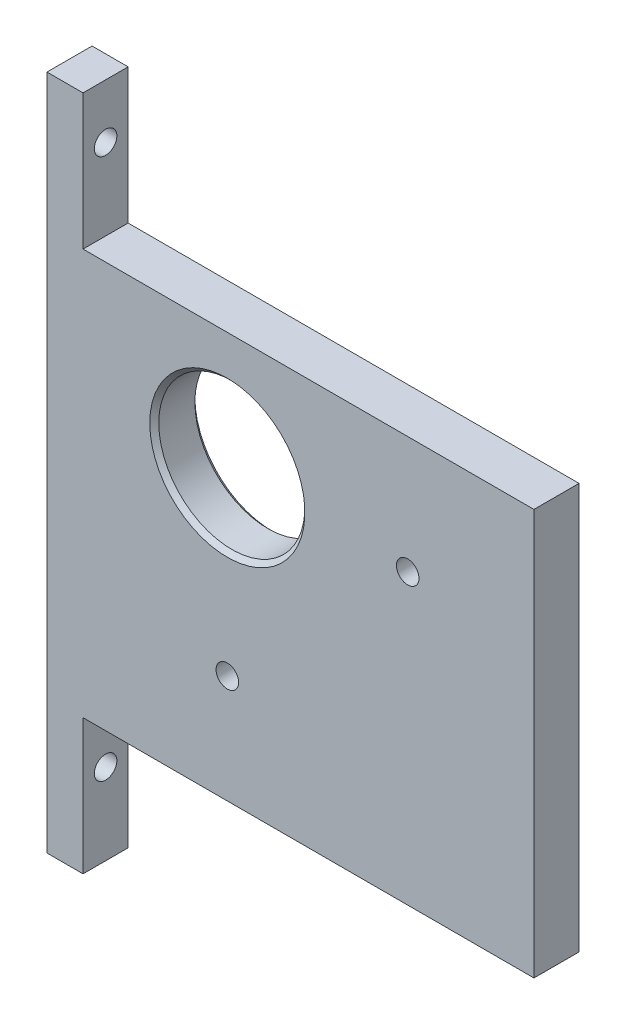
ISO-10303-21;
HEADER;
FILE_DESCRIPTION(('STEP AP214'),'2;1');
FILE_NAME('part.step','',(''),(''),'','','');
FILE_SCHEMA(('AUTOMOTIVE_DESIGN { 1 0 10303 214 1 1 1 1 }'));
ENDSEC;
DATA;
#1=APPLICATION_CONTEXT('core data for automotive mechanical design processes');
#2=APPLICATION_PROTOCOL_DEFINITION('international standard','automotive_design',2000,#1);
#3=PRODUCT_CONTEXT('',#1,'mechanical');
#4=PRODUCT('Part','Part','',(#3));
#5=PRODUCT_RELATED_PRODUCT_CATEGORY('part','',(#4));
#6=PRODUCT_DEFINITION_FORMATION('','',#4);
#7=PRODUCT_DEFINITION_CONTEXT('part definition',#1,'design');
#8=PRODUCT_DEFINITION('design','',#6,#7);
#9=PRODUCT_DEFINITION_SHAPE('','',#8);
#10=(LENGTH_UNIT() NAMED_UNIT(*) SI_UNIT(.MILLI.,.METRE.));
#11=(NAMED_UNIT(*) PLANE_ANGLE_UNIT() SI_UNIT($,.RADIAN.));
#12=(NAMED_UNIT(*) SI_UNIT($,.STERADIAN.) SOLID_ANGLE_UNIT());
#13=UNCERTAINTY_MEASURE_WITH_UNIT(LENGTH_MEASURE(1.E-05),#10,'distance_accuracy_value','');
#14=(GEOMETRIC_REPRESENTATION_CONTEXT(3) GLOBAL_UNCERTAINTY_ASSIGNED_CONTEXT((#13)) GLOBAL_UNIT_ASSIGNED_CONTEXT((#10,
#11,#12)) REPRESENTATION_CONTEXT('',''));
#15=CARTESIAN_POINT('',(0.,0.,0.));
#16=DIRECTION('',(0.,0.,1.));
#17=DIRECTION('',(1.,0.,0.));
#18=AXIS2_PLACEMENT_3D('',#15,#16,#17);
#19=CARTESIAN_POINT('',(0.,0.,5.));
#20=DIRECTION('',(0.,0.,-1.));
#21=DIRECTION('',(-1.,0.,0.));
#22=AXIS2_PLACEMENT_3D('',#19,#20,#21);
#23=PLANE('',#22);
#24=CARTESIAN_POINT('',(20.,47.,5.));
#25=DIRECTION('',(0.,0.,-1.));
#26=DIRECTION('',(-1.,0.,0.));
#27=AXIS2_PLACEMENT_3D('',#24,#25,#26);
#28=CIRCLE('',#27,8.6);
#29=CARTESIAN_POINT('',(11.4,47.,5.));
#30=VERTEX_POINT('',#29);
#31=EDGE_CURVE('E198',#30,#30,#28,.T.);
#32=ORIENTED_EDGE('',*,*,#31,.T.);
#33=EDGE_LOOP('',(#32));
#34=FACE_BOUND('',#33,.T.);
#35=CARTESIAN_POINT('',(40.,47.,5.));
#36=DIRECTION('',(0.,0.,-1.));
#37=DIRECTION('',(-1.,0.,0.));
#38=AXIS2_PLACEMENT_3D('',#35,#36,#37);
#39=CIRCLE('',#38,1.25);
#40=CARTESIAN_POINT('',(38.75,47.,5.));
#41=VERTEX_POINT('',#40);
#42=EDGE_CURVE('E297',#41,#41,#39,.T.);
#43=ORIENTED_EDGE('',*,*,#42,.T.);
#44=EDGE_LOOP('',(#43));
#45=FACE_BOUND('',#44,.T.);
#46=CARTESIAN_POINT('',(20.,27.,5.));
#47=DIRECTION('',(0.,0.,-1.));
#48=DIRECTION('',(-1.,0.,0.));
#49=AXIS2_PLACEMENT_3D('',#46,#47,#48);
#50=CIRCLE('',#49,1.25);
#51=CARTESIAN_POINT('',(18.75,27.,5.));
#52=VERTEX_POINT('',#51);
#53=EDGE_CURVE('E304',#52,#52,#50,.T.);
#54=ORIENTED_EDGE('',*,*,#53,.T.);
#55=EDGE_LOOP('',(#54));
#56=FACE_BOUND('',#55,.T.);
#57=DIRECTION('',(1.,0.,0.));
#58=VECTOR('',#57,1.);
#59=CARTESIAN_POINT('',(4.,15.,5.));
#60=LINE('',#59,#58);
#61=CARTESIAN_POINT('',(4.,15.,5.));
#62=VERTEX_POINT('',#61);
#63=CARTESIAN_POINT('',(54.,15.,5.));
#64=VERTEX_POINT('',#63);
#65=EDGE_CURVE('E132',#62,#64,#60,.T.);
#66=ORIENTED_EDGE('',*,*,#65,.T.);
#67=DIRECTION('',(0.,1.,0.));
#68=VECTOR('',#67,1.);
#69=CARTESIAN_POINT('',(54.,0.,5.));
#70=LINE('',#69,#68);
#71=CARTESIAN_POINT('',(54.,60.,5.));
#72=VERTEX_POINT('',#71);
#73=EDGE_CURVE('E129',#64,#72,#70,.T.);
#74=ORIENTED_EDGE('',*,*,#73,.T.);
#75=DIRECTION('',(-1.,0.,0.));
#76=VECTOR('',#75,1.);
#77=CARTESIAN_POINT('',(4.,60.,5.));
#78=LINE('',#77,#76);
#79=CARTESIAN_POINT('',(4.,60.,5.));
#80=VERTEX_POINT('',#79);
#81=EDGE_CURVE('E122',#72,#80,#78,.T.);
#82=ORIENTED_EDGE('',*,*,#81,.T.);
#83=DIRECTION('',(0.,1.,0.));
#84=VECTOR('',#83,1.);
#85=CARTESIAN_POINT('',(4.,60.,5.));
#86=LINE('',#85,#84);
#87=CARTESIAN_POINT('',(4.,75.,5.));
#88=VERTEX_POINT('',#87);
#89=EDGE_CURVE('E126',#80,#88,#86,.T.);
#90=ORIENTED_EDGE('',*,*,#89,.T.);
#91=DIRECTION('',(-1.,0.,0.));
#92=VECTOR('',#91,1.);
#93=CARTESIAN_POINT('',(0.,75.,5.));
#94=LINE('',#93,#92);
#95=CARTESIAN_POINT('',(0.,75.,5.));
#96=VERTEX_POINT('',#95);
#97=EDGE_CURVE('E76',#88,#96,#94,.T.);
#98=ORIENTED_EDGE('',*,*,#97,.T.);
#99=DIRECTION('',(0.,-1.,0.));
#100=VECTOR('',#99,1.);
#101=CARTESIAN_POINT('',(0.,0.,5.));
#102=LINE('',#101,#100);
#103=CARTESIAN_POINT('',(0.,0.,5.));
#104=VERTEX_POINT('',#103);
#105=EDGE_CURVE('E175',#96,#104,#102,.T.);
#106=ORIENTED_EDGE('',*,*,#105,.T.);
#107=DIRECTION('',(1.,0.,0.));
#108=VECTOR('',#107,1.);
#109=CARTESIAN_POINT('',(0.,0.,5.));
#110=LINE('',#109,#108);
#111=CARTESIAN_POINT('',(4.,0.,5.));
#112=VERTEX_POINT('',#111);
#113=EDGE_CURVE('E112',#104,#112,#110,.T.);
#114=ORIENTED_EDGE('',*,*,#113,.T.);
#115=DIRECTION('',(0.,1.,0.));
#116=VECTOR('',#115,1.);
#117=CARTESIAN_POINT('',(4.,0.,5.));
#118=LINE('',#117,#116);
#119=EDGE_CURVE('E278',#112,#62,#118,.T.);
#120=ORIENTED_EDGE('',*,*,#119,.T.);
#121=EDGE_LOOP('',(#66,#74,#82,#90,#98,#106,#114,#120));
#122=FACE_BOUND('',#121,.T.);
#123=ADVANCED_FACE('F51',(#34,#45,#56,#122),#23,.F.);
#124=CARTESIAN_POINT('',(0.,0.,0.));
#125=DIRECTION('',(0.,0.,-1.));
#126=DIRECTION('',(-1.,0.,0.));
#127=AXIS2_PLACEMENT_3D('',#124,#125,#126);
#128=PLANE('',#127);
#129=DIRECTION('',(0.,1.,0.));
#130=VECTOR('',#129,1.);
#131=CARTESIAN_POINT('',(54.,60.,0.));
#132=LINE('',#131,#130);
#133=CARTESIAN_POINT('',(54.,15.,0.));
#134=VERTEX_POINT('',#133);
#135=CARTESIAN_POINT('',(54.,60.,0.));
#136=VERTEX_POINT('',#135);
#137=EDGE_CURVE('E68',#134,#136,#132,.T.);
#138=ORIENTED_EDGE('',*,*,#137,.F.);
#139=DIRECTION('',(1.,0.,0.));
#140=VECTOR('',#139,1.);
#141=CARTESIAN_POINT('',(4.,15.,0.));
#142=LINE('',#141,#140);
#143=CARTESIAN_POINT('',(4.,15.,0.));
#144=VERTEX_POINT('',#143);
#145=EDGE_CURVE('E164',#144,#134,#142,.T.);
#146=ORIENTED_EDGE('',*,*,#145,.F.);
#147=DIRECTION('',(0.,1.,0.));
#148=VECTOR('',#147,1.);
#149=CARTESIAN_POINT('',(4.,0.,0.));
#150=LINE('',#149,#148);
#151=CARTESIAN_POINT('',(4.,0.,0.));
#152=VERTEX_POINT('',#151);
#153=EDGE_CURVE('E161',#152,#144,#150,.T.);
#154=ORIENTED_EDGE('',*,*,#153,.F.);
#155=DIRECTION('',(1.,0.,0.));
#156=VECTOR('',#155,1.);
#157=CARTESIAN_POINT('',(0.,0.,0.));
#158=LINE('',#157,#156);
#159=CARTESIAN_POINT('',(0.,0.,0.));
#160=VERTEX_POINT('',#159);
#161=EDGE_CURVE('E157',#160,#152,#158,.T.);
#162=ORIENTED_EDGE('',*,*,#161,.F.);
#163=DIRECTION('',(0.,-1.,0.));
#164=VECTOR('',#163,1.);
#165=CARTESIAN_POINT('',(0.,0.,0.));
#166=LINE('',#165,#164);
#167=CARTESIAN_POINT('',(0.,75.,0.));
#168=VERTEX_POINT('',#167);
#169=EDGE_CURVE('E153',#168,#160,#166,.T.);
#170=ORIENTED_EDGE('',*,*,#169,.F.);
#171=DIRECTION('',(-1.,0.,0.));
#172=VECTOR('',#171,1.);
#173=CARTESIAN_POINT('',(0.,75.,0.));
#174=LINE('',#173,#172);
#175=CARTESIAN_POINT('',(4.,75.,0.));
#176=VERTEX_POINT('',#175);
#177=EDGE_CURVE('E103',#176,#168,#174,.T.);
#178=ORIENTED_EDGE('',*,*,#177,.F.);
#179=DIRECTION('',(0.,1.,0.));
#180=VECTOR('',#179,1.);
#181=CARTESIAN_POINT('',(4.,60.,0.));
#182=LINE('',#181,#180);
#183=CARTESIAN_POINT('',(4.,60.,0.));
#184=VERTEX_POINT('',#183);
#185=EDGE_CURVE('E170',#184,#176,#182,.T.);
#186=ORIENTED_EDGE('',*,*,#185,.F.);
#187=DIRECTION('',(-1.,0.,0.));
#188=VECTOR('',#187,1.);
#189=CARTESIAN_POINT('',(4.,60.,0.));
#190=LINE('',#189,#188);
#191=EDGE_CURVE('E138',#136,#184,#190,.T.);
#192=ORIENTED_EDGE('',*,*,#191,.F.);
#193=EDGE_LOOP('',(#138,#146,#154,#162,#170,#178,#186,#192));
#194=FACE_BOUND('',#193,.T.);
#195=CARTESIAN_POINT('',(20.,47.,0.));
#196=DIRECTION('',(0.,0.,-1.));
#197=DIRECTION('',(-1.,0.,0.));
#198=AXIS2_PLACEMENT_3D('',#195,#196,#197);
#199=CIRCLE('',#198,8.60000000000001);
#200=CARTESIAN_POINT('',(11.4,47.,0.));
#201=VERTEX_POINT('',#200);
#202=EDGE_CURVE('E61',#201,#201,#199,.F.);
#203=ORIENTED_EDGE('',*,*,#202,.T.);
#204=EDGE_LOOP('',(#203));
#205=FACE_BOUND('',#204,.T.);
#206=CARTESIAN_POINT('',(40.,47.,0.));
#207=DIRECTION('',(0.,0.,-1.));
#208=DIRECTION('',(-1.,0.,0.));
#209=AXIS2_PLACEMENT_3D('',#206,#207,#208);
#210=CIRCLE('',#209,1.25);
#211=CARTESIAN_POINT('',(38.75,47.,0.));
#212=VERTEX_POINT('',#211);
#213=EDGE_CURVE('E308',#212,#212,#210,.T.);
#214=ORIENTED_EDGE('',*,*,#213,.F.);
#215=EDGE_LOOP('',(#214));
#216=FACE_BOUND('',#215,.T.);
#217=CARTESIAN_POINT('',(20.,27.,0.));
#218=DIRECTION('',(0.,0.,-1.));
#219=DIRECTION('',(-1.,0.,0.));
#220=AXIS2_PLACEMENT_3D('',#217,#218,#219);
#221=CIRCLE('',#220,1.25);
#222=CARTESIAN_POINT('',(18.75,27.,0.));
#223=VERTEX_POINT('',#222);
#224=EDGE_CURVE('E309',#223,#223,#221,.T.);
#225=ORIENTED_EDGE('',*,*,#224,.F.);
#226=EDGE_LOOP('',(#225));
#227=FACE_BOUND('',#226,.T.);
#228=ADVANCED_FACE('F205',(#194,#205,#216,#227),#128,.T.);
#229=CARTESIAN_POINT('',(0.,0.,5.));
#230=DIRECTION('',(1.,0.,0.));
#231=DIRECTION('',(0.,0.,-1.));
#232=AXIS2_PLACEMENT_3D('',#229,#230,#231);
#233=PLANE('',#232);
#234=CARTESIAN_POINT('',(0.,69.,2.5));
#235=DIRECTION('',(1.,0.,0.));
#236=DIRECTION('',(0.,0.,-1.));
#237=AXIS2_PLACEMENT_3D('',#234,#235,#236);
#238=CIRCLE('',#237,1.25);
#239=CARTESIAN_POINT('',(0.,69.,1.25));
#240=VERTEX_POINT('',#239);
#241=EDGE_CURVE('E266',#240,#240,#238,.T.);
#242=ORIENTED_EDGE('',*,*,#241,.T.);
#243=EDGE_LOOP('',(#242));
#244=FACE_BOUND('',#243,.T.);
#245=CARTESIAN_POINT('',(0.,9.,2.5));
#246=DIRECTION('',(1.,0.,0.));
#247=DIRECTION('',(0.,0.,-1.));
#248=AXIS2_PLACEMENT_3D('',#245,#246,#247);
#249=CIRCLE('',#248,1.25);
#250=CARTESIAN_POINT('',(0.,9.,1.25));
#251=VERTEX_POINT('',#250);
#252=EDGE_CURVE('E158',#251,#251,#249,.T.);
#253=ORIENTED_EDGE('',*,*,#252,.T.);
#254=EDGE_LOOP('',(#253));
#255=FACE_BOUND('',#254,.T.);
#256=ORIENTED_EDGE('',*,*,#169,.T.);
#257=DIRECTION('',(0.,0.,-1.));
#258=VECTOR('',#257,1.);
#259=CARTESIAN_POINT('',(0.,0.,5.));
#260=LINE('',#259,#258);
#261=EDGE_CURVE('E187',#104,#160,#260,.T.);
#262=ORIENTED_EDGE('',*,*,#261,.F.);
#263=ORIENTED_EDGE('',*,*,#105,.F.);
#264=DIRECTION('',(0.,0.,-1.));
#265=VECTOR('',#264,1.);
#266=CARTESIAN_POINT('',(0.,75.,5.));
#267=LINE('',#266,#265);
#268=EDGE_CURVE('E149',#96,#168,#267,.T.);
#269=ORIENTED_EDGE('',*,*,#268,.T.);
#270=EDGE_LOOP('',(#256,#262,#263,#269));
#271=FACE_BOUND('',#270,.T.);
#272=ADVANCED_FACE('F226',(#244,#255,#271),#233,.F.);
#273=CARTESIAN_POINT('',(0.,0.,5.));
#274=DIRECTION('',(0.,1.,0.));
#275=DIRECTION('',(0.,0.,1.));
#276=AXIS2_PLACEMENT_3D('',#273,#274,#275);
#277=PLANE('',#276);
#278=ORIENTED_EDGE('',*,*,#161,.T.);
#279=DIRECTION('',(0.,0.,-1.));
#280=VECTOR('',#279,1.);
#281=CARTESIAN_POINT('',(4.,0.,5.));
#282=LINE('',#281,#280);
#283=EDGE_CURVE('E183',#112,#152,#282,.T.);
#284=ORIENTED_EDGE('',*,*,#283,.F.);
#285=ORIENTED_EDGE('',*,*,#113,.F.);
#286=ORIENTED_EDGE('',*,*,#261,.T.);
#287=EDGE_LOOP('',(#278,#284,#285,#286));
#288=FACE_BOUND('',#287,.T.);
#289=ADVANCED_FACE('F249',(#288),#277,.F.);
#290=CARTESIAN_POINT('',(4.,0.,5.));
#291=DIRECTION('',(-1.,0.,0.));
#292=DIRECTION('',(0.,0.,1.));
#293=AXIS2_PLACEMENT_3D('',#290,#291,#292);
#294=PLANE('',#293);
#295=CARTESIAN_POINT('',(4.,9.,2.5));
#296=DIRECTION('',(1.,0.,0.));
#297=DIRECTION('',(0.,0.,1.));
#298=AXIS2_PLACEMENT_3D('',#295,#296,#297);
#299=CIRCLE('',#298,1.25);
#300=CARTESIAN_POINT('',(4.,9.,3.75));
#301=VERTEX_POINT('',#300);
#302=EDGE_CURVE('E293',#301,#301,#299,.T.);
#303=ORIENTED_EDGE('',*,*,#302,.F.);
#304=EDGE_LOOP('',(#303));
#305=FACE_BOUND('',#304,.T.);
#306=ORIENTED_EDGE('',*,*,#153,.T.);
#307=DIRECTION('',(0.,0.,-1.));
#308=VECTOR('',#307,1.);
#309=CARTESIAN_POINT('',(4.,15.,5.));
#310=LINE('',#309,#308);
#311=EDGE_CURVE('E142',#62,#144,#310,.T.);
#312=ORIENTED_EDGE('',*,*,#311,.F.);
#313=ORIENTED_EDGE('',*,*,#119,.F.);
#314=ORIENTED_EDGE('',*,*,#283,.T.);
#315=EDGE_LOOP('',(#306,#312,#313,#314));
#316=FACE_BOUND('',#315,.T.);
#317=ADVANCED_FACE('F245',(#305,#316),#294,.F.);
#318=CARTESIAN_POINT('',(4.,15.,5.));
#319=DIRECTION('',(0.,1.,0.));
#320=DIRECTION('',(0.,0.,1.));
#321=AXIS2_PLACEMENT_3D('',#318,#319,#320);
#322=PLANE('',#321);
#323=ORIENTED_EDGE('',*,*,#145,.T.);
#324=DIRECTION('',(0.,0.,-1.));
#325=VECTOR('',#324,1.);
#326=CARTESIAN_POINT('',(54.,15.,10.));
#327=LINE('',#326,#325);
#328=EDGE_CURVE('E318',#64,#134,#327,.T.);
#329=ORIENTED_EDGE('',*,*,#328,.F.);
#330=ORIENTED_EDGE('',*,*,#65,.F.);
#331=ORIENTED_EDGE('',*,*,#311,.T.);
#332=EDGE_LOOP('',(#323,#329,#330,#331));
#333=FACE_BOUND('',#332,.T.);
#334=ADVANCED_FACE('F242',(#333),#322,.F.);
#335=CARTESIAN_POINT('',(4.,60.,5.));
#336=DIRECTION('',(0.,-1.,0.));
#337=DIRECTION('',(0.,0.,-1.));
#338=AXIS2_PLACEMENT_3D('',#335,#336,#337);
#339=PLANE('',#338);
#340=ORIENTED_EDGE('',*,*,#81,.F.);
#341=DIRECTION('',(0.,0.,-1.));
#342=VECTOR('',#341,1.);
#343=CARTESIAN_POINT('',(54.,60.,5.));
#344=LINE('',#343,#342);
#345=EDGE_CURVE('E11',#72,#136,#344,.T.);
#346=ORIENTED_EDGE('',*,*,#345,.T.);
#347=ORIENTED_EDGE('',*,*,#191,.T.);
#348=DIRECTION('',(0.,0.,-1.));
#349=VECTOR('',#348,1.);
#350=CARTESIAN_POINT('',(4.,60.,5.));
#351=LINE('',#350,#349);
#352=EDGE_CURVE('E135',#80,#184,#351,.T.);
#353=ORIENTED_EDGE('',*,*,#352,.F.);
#354=EDGE_LOOP('',(#340,#346,#347,#353));
#355=FACE_BOUND('',#354,.T.);
#356=ADVANCED_FACE('F136',(#355),#339,.F.);
#357=CARTESIAN_POINT('',(4.,60.,5.));
#358=DIRECTION('',(-1.,0.,0.));
#359=DIRECTION('',(0.,0.,1.));
#360=AXIS2_PLACEMENT_3D('',#357,#358,#359);
#361=PLANE('',#360);
#362=CARTESIAN_POINT('',(4.,69.,2.5));
#363=DIRECTION('',(1.,0.,0.));
#364=DIRECTION('',(0.,0.,-1.));
#365=AXIS2_PLACEMENT_3D('',#362,#363,#364);
#366=CIRCLE('',#365,1.25);
#367=CARTESIAN_POINT('',(4.,69.,1.25));
#368=VERTEX_POINT('',#367);
#369=EDGE_CURVE('E292',#368,#368,#366,.T.);
#370=ORIENTED_EDGE('',*,*,#369,.F.);
#371=EDGE_LOOP('',(#370));
#372=FACE_BOUND('',#371,.T.);
#373=ORIENTED_EDGE('',*,*,#185,.T.);
#374=DIRECTION('',(0.,0.,-1.));
#375=VECTOR('',#374,1.);
#376=CARTESIAN_POINT('',(4.,75.,5.));
#377=LINE('',#376,#375);
#378=EDGE_CURVE('E143',#88,#176,#377,.T.);
#379=ORIENTED_EDGE('',*,*,#378,.F.);
#380=ORIENTED_EDGE('',*,*,#89,.F.);
#381=ORIENTED_EDGE('',*,*,#352,.T.);
#382=EDGE_LOOP('',(#373,#379,#380,#381));
#383=FACE_BOUND('',#382,.T.);
#384=ADVANCED_FACE('F145',(#372,#383),#361,.F.);
#385=CARTESIAN_POINT('',(0.,75.,5.));
#386=DIRECTION('',(0.,-1.,0.));
#387=DIRECTION('',(0.,0.,-1.));
#388=AXIS2_PLACEMENT_3D('',#385,#386,#387);
#389=PLANE('',#388);
#390=ORIENTED_EDGE('',*,*,#177,.T.);
#391=ORIENTED_EDGE('',*,*,#268,.F.);
#392=ORIENTED_EDGE('',*,*,#97,.F.);
#393=ORIENTED_EDGE('',*,*,#378,.T.);
#394=EDGE_LOOP('',(#390,#391,#392,#393));
#395=FACE_BOUND('',#394,.T.);
#396=ADVANCED_FACE('F234',(#395),#389,.F.);
#397=CARTESIAN_POINT('',(20.,47.,5.));
#398=DIRECTION('',(0.,0.,-1.));
#399=DIRECTION('',(-1.,0.,0.));
#400=AXIS2_PLACEMENT_3D('',#397,#398,#399);
#401=CYLINDRICAL_SURFACE('',#400,8.1);
#402=CARTESIAN_POINT('',(20.,47.,4.5));
#403=DIRECTION('',(0.,0.,-1.));
#404=DIRECTION('',(-1.,0.,0.));
#405=AXIS2_PLACEMENT_3D('',#402,#403,#404);
#406=CIRCLE('',#405,8.1);
#407=CARTESIAN_POINT('',(11.9,47.,4.5));
#408=VERTEX_POINT('',#407);
#409=EDGE_CURVE('E194',#408,#408,#406,.F.);
#410=ORIENTED_EDGE('',*,*,#409,.T.);
#411=EDGE_LOOP('',(#410));
#412=FACE_BOUND('',#411,.T.);
#413=CARTESIAN_POINT('',(20.,47.,0.500000000000011));
#414=DIRECTION('',(0.,0.,-1.));
#415=DIRECTION('',(-1.,0.,0.));
#416=AXIS2_PLACEMENT_3D('',#413,#414,#415);
#417=CIRCLE('',#416,8.1);
#418=CARTESIAN_POINT('',(11.9,47.,0.500000000000011));
#419=VERTEX_POINT('',#418);
#420=EDGE_CURVE('E190',#419,#419,#417,.T.);
#421=ORIENTED_EDGE('',*,*,#420,.T.);
#422=EDGE_LOOP('',(#421));
#423=FACE_BOUND('',#422,.T.);
#424=ADVANCED_FACE('F231',(#412,#423),#401,.F.);
#425=CARTESIAN_POINT('',(-1.,69.,2.5));
#426=DIRECTION('',(1.,0.,0.));
#427=DIRECTION('',(0.,0.,-1.));
#428=AXIS2_PLACEMENT_3D('',#425,#426,#427);
#429=CYLINDRICAL_SURFACE('',#428,1.25);
#430=ORIENTED_EDGE('',*,*,#369,.T.);
#431=EDGE_LOOP('',(#430));
#432=FACE_BOUND('',#431,.T.);
#433=ORIENTED_EDGE('',*,*,#241,.F.);
#434=EDGE_LOOP('',(#433));
#435=FACE_BOUND('',#434,.T.);
#436=ADVANCED_FACE('F345',(#432,#435),#429,.F.);
#437=CARTESIAN_POINT('',(-1.,9.,2.5));
#438=DIRECTION('',(1.,0.,0.));
#439=DIRECTION('',(0.,0.,-1.));
#440=AXIS2_PLACEMENT_3D('',#437,#438,#439);
#441=CYLINDRICAL_SURFACE('',#440,1.25);
#442=ORIENTED_EDGE('',*,*,#302,.T.);
#443=EDGE_LOOP('',(#442));
#444=FACE_BOUND('',#443,.T.);
#445=ORIENTED_EDGE('',*,*,#252,.F.);
#446=EDGE_LOOP('',(#445));
#447=FACE_BOUND('',#446,.T.);
#448=ADVANCED_FACE('F335',(#444,#447),#441,.F.);
#449=CARTESIAN_POINT('',(20.,27.,120.));
#450=DIRECTION('',(0.,0.,-1.));
#451=DIRECTION('',(-1.,0.,0.));
#452=AXIS2_PLACEMENT_3D('',#449,#450,#451);
#453=CYLINDRICAL_SURFACE('',#452,1.25);
#454=ORIENTED_EDGE('',*,*,#224,.T.);
#455=EDGE_LOOP('',(#454));
#456=FACE_BOUND('',#455,.T.);
#457=ORIENTED_EDGE('',*,*,#53,.F.);
#458=EDGE_LOOP('',(#457));
#459=FACE_BOUND('',#458,.T.);
#460=ADVANCED_FACE('F332',(#456,#459),#453,.F.);
#461=CARTESIAN_POINT('',(40.,47.,120.));
#462=DIRECTION('',(0.,0.,-1.));
#463=DIRECTION('',(-1.,0.,0.));
#464=AXIS2_PLACEMENT_3D('',#461,#462,#463);
#465=CYLINDRICAL_SURFACE('',#464,1.25);
#466=ORIENTED_EDGE('',*,*,#213,.T.);
#467=EDGE_LOOP('',(#466));
#468=FACE_BOUND('',#467,.T.);
#469=ORIENTED_EDGE('',*,*,#42,.F.);
#470=EDGE_LOOP('',(#469));
#471=FACE_BOUND('',#470,.T.);
#472=ADVANCED_FACE('F218',(#468,#471),#465,.F.);
#473=CARTESIAN_POINT('',(20.,47.,4.5));
#474=DIRECTION('',(0.,0.,1.));
#475=DIRECTION('',(1.,0.,0.));
#476=AXIS2_PLACEMENT_3D('',#473,#474,#475);
#477=CONICAL_SURFACE('',#476,8.1,0.785398163397448);
#478=ORIENTED_EDGE('',*,*,#31,.F.);
#479=EDGE_LOOP('',(#478));
#480=FACE_BOUND('',#479,.T.);
#481=ORIENTED_EDGE('',*,*,#409,.F.);
#482=EDGE_LOOP('',(#481));
#483=FACE_BOUND('',#482,.T.);
#484=ADVANCED_FACE('F210',(#480,#483),#477,.F.);
#485=CARTESIAN_POINT('',(20.,47.,0.));
#486=DIRECTION('',(0.,0.,-1.));
#487=DIRECTION('',(-1.,0.,0.));
#488=AXIS2_PLACEMENT_3D('',#485,#486,#487);
#489=CONICAL_SURFACE('',#488,8.60000000000001,0.785398163397448);
#490=ORIENTED_EDGE('',*,*,#420,.F.);
#491=EDGE_LOOP('',(#490));
#492=FACE_BOUND('',#491,.T.);
#493=ORIENTED_EDGE('',*,*,#202,.F.);
#494=EDGE_LOOP('',(#493));
#495=FACE_BOUND('',#494,.T.);
#496=ADVANCED_FACE('F54',(#492,#495),#489,.F.);
#497=CARTESIAN_POINT('',(54.,60.,10.));
#498=DIRECTION('',(-1.,0.,0.));
#499=DIRECTION('',(0.,-1.,0.));
#500=AXIS2_PLACEMENT_3D('',#497,#498,#499);
#501=PLANE('',#500);
#502=ORIENTED_EDGE('',*,*,#328,.T.);
#503=ORIENTED_EDGE('',*,*,#137,.T.);
#504=ORIENTED_EDGE('',*,*,#345,.F.);
#505=ORIENTED_EDGE('',*,*,#73,.F.);
#506=EDGE_LOOP('',(#502,#503,#504,#505));
#507=FACE_BOUND('',#506,.T.);
#508=ADVANCED_FACE('F209',(#507),#501,.F.);
#509=CLOSED_SHELL('',(#123,#228,#272,#289,#317,#334,#356,#384,#396,#424,#436,#448,#460,#472,
#484,#496,#508));
#510=MANIFOLD_SOLID_BREP('B2',#509);
#511=ADVANCED_BREP_SHAPE_REPRESENTATION('',(#18,#510),#14);
#512=SHAPE_DEFINITION_REPRESENTATION(#9,#511);
ENDSEC;
END-ISO-10303-21;
